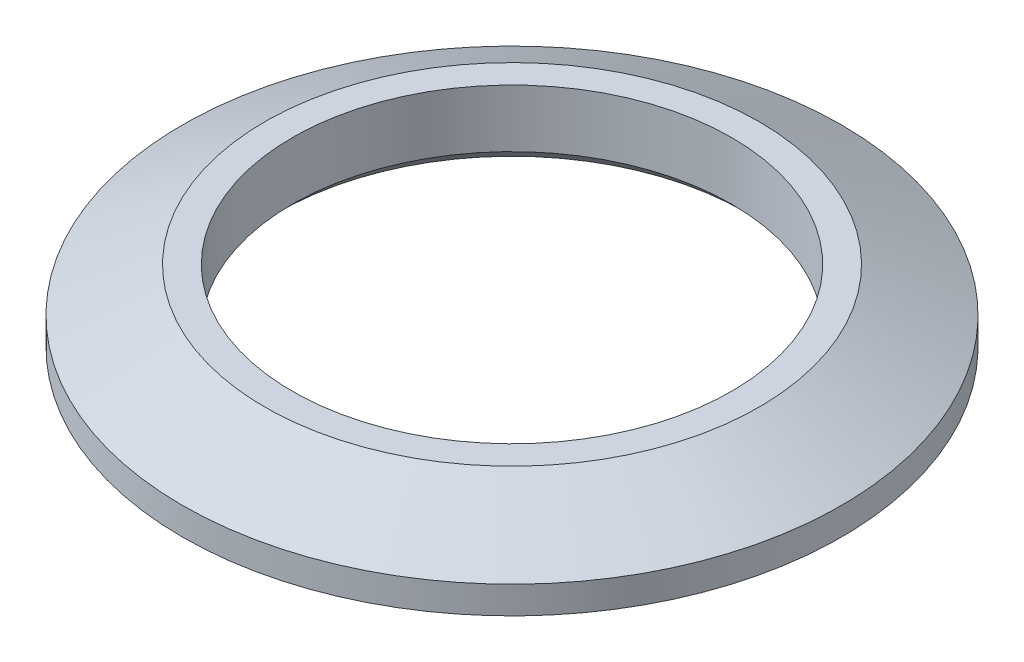
ISO-10303-21;
HEADER;
FILE_DESCRIPTION(('STEP AP214'),'2;1');
FILE_NAME('part.step','',(''),(''),'','','');
FILE_SCHEMA(('AUTOMOTIVE_DESIGN { 1 0 10303 214 1 1 1 1 }'));
ENDSEC;
DATA;
#1=APPLICATION_CONTEXT('core data for automotive mechanical design processes');
#2=APPLICATION_PROTOCOL_DEFINITION('international standard','automotive_design',2000,#1);
#3=PRODUCT_CONTEXT('',#1,'mechanical');
#4=PRODUCT('Part','Part','',(#3));
#5=PRODUCT_RELATED_PRODUCT_CATEGORY('part','',(#4));
#6=PRODUCT_DEFINITION_FORMATION('','',#4);
#7=PRODUCT_DEFINITION_CONTEXT('part definition',#1,'design');
#8=PRODUCT_DEFINITION('design','',#6,#7);
#9=PRODUCT_DEFINITION_SHAPE('','',#8);
#10=(LENGTH_UNIT() NAMED_UNIT(*) SI_UNIT(.MILLI.,.METRE.));
#11=(NAMED_UNIT(*) PLANE_ANGLE_UNIT() SI_UNIT($,.RADIAN.));
#12=(NAMED_UNIT(*) SI_UNIT($,.STERADIAN.) SOLID_ANGLE_UNIT());
#13=UNCERTAINTY_MEASURE_WITH_UNIT(LENGTH_MEASURE(1.E-05),#10,'distance_accuracy_value','');
#14=(GEOMETRIC_REPRESENTATION_CONTEXT(3) GLOBAL_UNCERTAINTY_ASSIGNED_CONTEXT((#13)) GLOBAL_UNIT_ASSIGNED_CONTEXT((#10,
#11,#12)) REPRESENTATION_CONTEXT('',''));
#15=CARTESIAN_POINT('',(0.,0.,0.));
#16=DIRECTION('',(0.,0.,1.));
#17=DIRECTION('',(1.,0.,0.));
#18=AXIS2_PLACEMENT_3D('',#15,#16,#17);
#19=CARTESIAN_POINT('',(0.,0.,0.));
#20=DIRECTION('',(0.,1.,0.));
#21=DIRECTION('',(0.,0.,1.));
#22=AXIS2_PLACEMENT_3D('',#19,#20,#21);
#23=PLANE('',#22);
#24=CARTESIAN_POINT('',(0.,0.,0.));
#25=DIRECTION('',(0.,-1.,0.));
#26=DIRECTION('',(0.,0.,-1.));
#27=AXIS2_PLACEMENT_3D('',#24,#25,#26);
#28=CIRCLE('',#27,4.25);
#29=CARTESIAN_POINT('',(0.,0.,-4.25));
#30=VERTEX_POINT('',#29);
#31=EDGE_CURVE('E10',#30,#30,#28,.T.);
#32=ORIENTED_EDGE('',*,*,#31,.F.);
#33=EDGE_LOOP('',(#32));
#34=FACE_BOUND('',#33,.T.);
#35=CARTESIAN_POINT('',(0.,0.,0.));
#36=DIRECTION('',(0.,-1.,0.));
#37=DIRECTION('',(0.,0.,-1.));
#38=AXIS2_PLACEMENT_3D('',#35,#36,#37);
#39=CIRCLE('',#38,6.);
#40=CARTESIAN_POINT('',(0.,0.,-6.));
#41=VERTEX_POINT('',#40);
#42=EDGE_CURVE('E72',#41,#41,#39,.T.);
#43=ORIENTED_EDGE('',*,*,#42,.T.);
#44=EDGE_LOOP('',(#43));
#45=FACE_BOUND('',#44,.T.);
#46=ADVANCED_FACE('F45',(#34,#45),#23,.F.);
#47=CARTESIAN_POINT('',(0.,0.,0.));
#48=DIRECTION('',(0.,-1.,0.));
#49=DIRECTION('',(0.,0.,-1.));
#50=AXIS2_PLACEMENT_3D('',#47,#48,#49);
#51=CONICAL_SURFACE('',#50,4.25,0.785398163397449);
#52=CARTESIAN_POINT('',(0.,0.25,0.));
#53=DIRECTION('',(0.,-1.,0.));
#54=DIRECTION('',(0.,0.,-1.));
#55=AXIS2_PLACEMENT_3D('',#52,#53,#54);
#56=CIRCLE('',#55,4.);
#57=CARTESIAN_POINT('',(0.,0.25,-4.));
#58=VERTEX_POINT('',#57);
#59=EDGE_CURVE('E52',#58,#58,#56,.T.);
#60=ORIENTED_EDGE('',*,*,#59,.F.);
#61=EDGE_LOOP('',(#60));
#62=FACE_BOUND('',#61,.T.);
#63=ORIENTED_EDGE('',*,*,#31,.T.);
#64=EDGE_LOOP('',(#63));
#65=FACE_BOUND('',#64,.T.);
#66=ADVANCED_FACE('F98',(#62,#65),#51,.F.);
#67=CARTESIAN_POINT('',(0.,0.,0.));
#68=DIRECTION('',(0.,-1.,0.));
#69=DIRECTION('',(0.,0.,-1.));
#70=AXIS2_PLACEMENT_3D('',#67,#68,#69);
#71=CYLINDRICAL_SURFACE('',#70,4.);
#72=CARTESIAN_POINT('',(0.,1.3,0.));
#73=DIRECTION('',(0.,-1.,0.));
#74=DIRECTION('',(0.,0.,-1.));
#75=AXIS2_PLACEMENT_3D('',#72,#73,#74);
#76=CIRCLE('',#75,4.);
#77=CARTESIAN_POINT('',(0.,1.3,-4.));
#78=VERTEX_POINT('',#77);
#79=EDGE_CURVE('E57',#78,#78,#76,.T.);
#80=ORIENTED_EDGE('',*,*,#79,.F.);
#81=EDGE_LOOP('',(#80));
#82=FACE_BOUND('',#81,.T.);
#83=ORIENTED_EDGE('',*,*,#59,.T.);
#84=EDGE_LOOP('',(#83));
#85=FACE_BOUND('',#84,.T.);
#86=ADVANCED_FACE('F93',(#82,#85),#71,.F.);
#87=CARTESIAN_POINT('',(0.,1.3,0.));
#88=DIRECTION('',(0.,-1.,0.));
#89=DIRECTION('',(0.,0.,-1.));
#90=AXIS2_PLACEMENT_3D('',#87,#88,#89);
#91=PLANE('',#90);
#92=CARTESIAN_POINT('',(0.,1.3,0.));
#93=DIRECTION('',(0.,-1.,0.));
#94=DIRECTION('',(0.,0.,-1.));
#95=AXIS2_PLACEMENT_3D('',#92,#93,#94);
#96=CIRCLE('',#95,4.5);
#97=CARTESIAN_POINT('',(0.,1.3,-4.5));
#98=VERTEX_POINT('',#97);
#99=EDGE_CURVE('E62',#98,#98,#96,.T.);
#100=ORIENTED_EDGE('',*,*,#99,.F.);
#101=EDGE_LOOP('',(#100));
#102=FACE_BOUND('',#101,.T.);
#103=ORIENTED_EDGE('',*,*,#79,.T.);
#104=EDGE_LOOP('',(#103));
#105=FACE_BOUND('',#104,.T.);
#106=ADVANCED_FACE('F87',(#102,#105),#91,.F.);
#107=CARTESIAN_POINT('',(0.,1.3,0.));
#108=DIRECTION('',(0.,-1.,0.));
#109=DIRECTION('',(0.,0.,-1.));
#110=AXIS2_PLACEMENT_3D('',#107,#108,#109);
#111=CONICAL_SURFACE('',#110,4.5,1.08083900054117);
#112=CARTESIAN_POINT('',(0.,0.5,0.));
#113=DIRECTION('',(0.,-1.,0.));
#114=DIRECTION('',(0.,0.,-1.));
#115=AXIS2_PLACEMENT_3D('',#112,#113,#114);
#116=CIRCLE('',#115,6.);
#117=CARTESIAN_POINT('',(0.,0.5,-6.));
#118=VERTEX_POINT('',#117);
#119=EDGE_CURVE('E68',#118,#118,#116,.T.);
#120=ORIENTED_EDGE('',*,*,#119,.F.);
#121=EDGE_LOOP('',(#120));
#122=FACE_BOUND('',#121,.T.);
#123=ORIENTED_EDGE('',*,*,#99,.T.);
#124=EDGE_LOOP('',(#123));
#125=FACE_BOUND('',#124,.T.);
#126=ADVANCED_FACE('F81',(#122,#125),#111,.T.);
#127=CARTESIAN_POINT('',(0.,0.,0.));
#128=DIRECTION('',(0.,-1.,0.));
#129=DIRECTION('',(0.,0.,-1.));
#130=AXIS2_PLACEMENT_3D('',#127,#128,#129);
#131=CYLINDRICAL_SURFACE('',#130,6.);
#132=ORIENTED_EDGE('',*,*,#42,.F.);
#133=EDGE_LOOP('',(#132));
#134=FACE_BOUND('',#133,.T.);
#135=ORIENTED_EDGE('',*,*,#119,.T.);
#136=EDGE_LOOP('',(#135));
#137=FACE_BOUND('',#136,.T.);
#138=ADVANCED_FACE('F78',(#134,#137),#131,.T.);
#139=CLOSED_SHELL('',(#46,#66,#86,#106,#126,#138));
#140=MANIFOLD_SOLID_BREP('B2',#139);
#141=ADVANCED_BREP_SHAPE_REPRESENTATION('',(#18,#140),#14);
#142=SHAPE_DEFINITION_REPRESENTATION(#9,#141);
ENDSEC;
END-ISO-10303-21;
